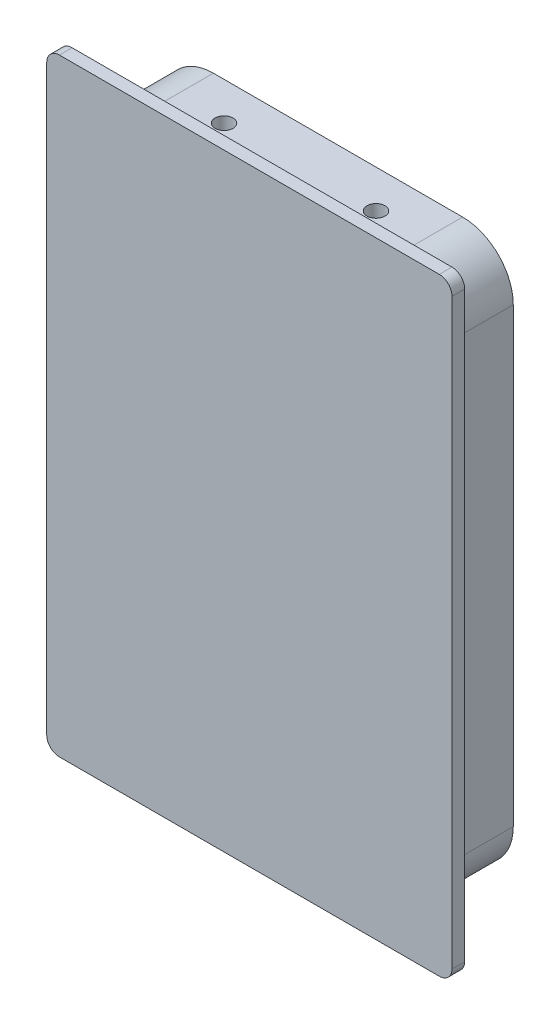
ISO-10303-21;
HEADER;
FILE_DESCRIPTION(('STEP AP214'),'2;1');
FILE_NAME('part.step','',(''),(''),'','','');
FILE_SCHEMA(('AUTOMOTIVE_DESIGN { 1 0 10303 214 1 1 1 1 }'));
ENDSEC;
DATA;
#1=APPLICATION_CONTEXT('core data for automotive mechanical design processes');
#2=APPLICATION_PROTOCOL_DEFINITION('international standard','automotive_design',2000,#1);
#3=PRODUCT_CONTEXT('',#1,'mechanical');
#4=PRODUCT('Part','Part','',(#3));
#5=PRODUCT_RELATED_PRODUCT_CATEGORY('part','',(#4));
#6=PRODUCT_DEFINITION_FORMATION('','',#4);
#7=PRODUCT_DEFINITION_CONTEXT('part definition',#1,'design');
#8=PRODUCT_DEFINITION('design','',#6,#7);
#9=PRODUCT_DEFINITION_SHAPE('','',#8);
#10=(LENGTH_UNIT() NAMED_UNIT(*) SI_UNIT(.MILLI.,.METRE.));
#11=(NAMED_UNIT(*) PLANE_ANGLE_UNIT() SI_UNIT($,.RADIAN.));
#12=(NAMED_UNIT(*) SI_UNIT($,.STERADIAN.) SOLID_ANGLE_UNIT());
#13=UNCERTAINTY_MEASURE_WITH_UNIT(LENGTH_MEASURE(1.E-05),#10,'distance_accuracy_value','');
#14=(GEOMETRIC_REPRESENTATION_CONTEXT(3) GLOBAL_UNCERTAINTY_ASSIGNED_CONTEXT((#13)) GLOBAL_UNIT_ASSIGNED_CONTEXT((#10,
#11,#12)) REPRESENTATION_CONTEXT('',''));
#15=CARTESIAN_POINT('',(0.,0.,0.));
#16=DIRECTION('',(0.,0.,1.));
#17=DIRECTION('',(1.,0.,0.));
#18=AXIS2_PLACEMENT_3D('',#15,#16,#17);
#19=CARTESIAN_POINT('',(25.4,38.1,0.));
#20=DIRECTION('',(0.,0.,-1.));
#21=DIRECTION('',(-1.,0.,0.));
#22=AXIS2_PLACEMENT_3D('',#19,#20,#21);
#23=PLANE('',#22);
#24=DIRECTION('',(1.,0.,0.));
#25=VECTOR('',#24,1.);
#26=CARTESIAN_POINT('',(-25.4,-38.1,0.));
#27=LINE('',#26,#25);
#28=CARTESIAN_POINT('',(-23.8125,-38.1,0.));
#29=VERTEX_POINT('',#28);
#30=CARTESIAN_POINT('',(23.8125,-38.1,0.));
#31=VERTEX_POINT('',#30);
#32=EDGE_CURVE('E285',#29,#31,#27,.T.);
#33=ORIENTED_EDGE('',*,*,#32,.F.);
#34=CARTESIAN_POINT('',(-23.8125,-36.5125,0.));
#35=DIRECTION('',(0.,0.,-1.));
#36=DIRECTION('',(-1.,0.,0.));
#37=AXIS2_PLACEMENT_3D('',#34,#35,#36);
#38=CIRCLE('',#37,1.5875);
#39=CARTESIAN_POINT('',(-25.4,-36.5125,0.));
#40=VERTEX_POINT('',#39);
#41=EDGE_CURVE('E349',#29,#40,#38,.T.);
#42=ORIENTED_EDGE('',*,*,#41,.T.);
#43=DIRECTION('',(0.,-1.,0.));
#44=VECTOR('',#43,1.);
#45=CARTESIAN_POINT('',(-25.4,-38.1,0.));
#46=LINE('',#45,#44);
#47=CARTESIAN_POINT('',(-25.4,36.5125,0.));
#48=VERTEX_POINT('',#47);
#49=EDGE_CURVE('E298',#48,#40,#46,.T.);
#50=ORIENTED_EDGE('',*,*,#49,.F.);
#51=CARTESIAN_POINT('',(-23.8125,36.5125,0.));
#52=DIRECTION('',(0.,0.,-1.));
#53=DIRECTION('',(-1.,0.,0.));
#54=AXIS2_PLACEMENT_3D('',#51,#52,#53);
#55=CIRCLE('',#54,1.5875);
#56=CARTESIAN_POINT('',(-23.8125,38.1,0.));
#57=VERTEX_POINT('',#56);
#58=EDGE_CURVE('E343',#48,#57,#55,.T.);
#59=ORIENTED_EDGE('',*,*,#58,.T.);
#60=DIRECTION('',(-1.,0.,0.));
#61=VECTOR('',#60,1.);
#62=CARTESIAN_POINT('',(-25.4,38.1,0.));
#63=LINE('',#62,#61);
#64=CARTESIAN_POINT('',(23.8125,38.1,0.));
#65=VERTEX_POINT('',#64);
#66=EDGE_CURVE('E296',#65,#57,#63,.T.);
#67=ORIENTED_EDGE('',*,*,#66,.F.);
#68=CARTESIAN_POINT('',(23.8125,36.5125,0.));
#69=DIRECTION('',(0.,0.,-1.));
#70=DIRECTION('',(-1.,0.,0.));
#71=AXIS2_PLACEMENT_3D('',#68,#69,#70);
#72=CIRCLE('',#71,1.5875);
#73=CARTESIAN_POINT('',(25.4,36.5125,0.));
#74=VERTEX_POINT('',#73);
#75=EDGE_CURVE('E345',#65,#74,#72,.T.);
#76=ORIENTED_EDGE('',*,*,#75,.T.);
#77=DIRECTION('',(0.,1.,0.));
#78=VECTOR('',#77,1.);
#79=CARTESIAN_POINT('',(25.4,-38.1,0.));
#80=LINE('',#79,#78);
#81=CARTESIAN_POINT('',(25.4,-36.5125,0.));
#82=VERTEX_POINT('',#81);
#83=EDGE_CURVE('E271',#82,#74,#80,.T.);
#84=ORIENTED_EDGE('',*,*,#83,.F.);
#85=CARTESIAN_POINT('',(23.8125,-36.5125,0.));
#86=DIRECTION('',(0.,0.,-1.));
#87=DIRECTION('',(-1.,0.,0.));
#88=AXIS2_PLACEMENT_3D('',#85,#86,#87);
#89=CIRCLE('',#88,1.5875);
#90=EDGE_CURVE('E347',#82,#31,#89,.T.);
#91=ORIENTED_EDGE('',*,*,#90,.T.);
#92=EDGE_LOOP('',(#33,#42,#50,#59,#67,#76,#84,#91));
#93=FACE_BOUND('',#92,.T.);
#94=DIRECTION('',(1.,0.,0.));
#95=VECTOR('',#94,1.);
#96=CARTESIAN_POINT('',(21.971,34.671,0.));
#97=LINE('',#96,#95);
#98=CARTESIAN_POINT('',(-15.621,34.671,0.));
#99=VERTEX_POINT('',#98);
#100=CARTESIAN_POINT('',(15.621,34.671,0.));
#101=VERTEX_POINT('',#100);
#102=EDGE_CURVE('E274',#99,#101,#97,.T.);
#103=ORIENTED_EDGE('',*,*,#102,.F.);
#104=CARTESIAN_POINT('',(-15.621,28.321,0.));
#105=DIRECTION('',(0.,0.,-1.));
#106=DIRECTION('',(-1.,0.,0.));
#107=AXIS2_PLACEMENT_3D('',#104,#105,#106);
#108=CIRCLE('',#107,6.35);
#109=CARTESIAN_POINT('',(-21.971,28.321,0.));
#110=VERTEX_POINT('',#109);
#111=EDGE_CURVE('E334',#99,#110,#108,.F.);
#112=ORIENTED_EDGE('',*,*,#111,.T.);
#113=DIRECTION('',(0.,1.,0.));
#114=VECTOR('',#113,1.);
#115=CARTESIAN_POINT('',(-21.971,-34.671,0.));
#116=LINE('',#115,#114);
#117=CARTESIAN_POINT('',(-21.971,-28.321,0.));
#118=VERTEX_POINT('',#117);
#119=EDGE_CURVE('E256',#118,#110,#116,.T.);
#120=ORIENTED_EDGE('',*,*,#119,.F.);
#121=CARTESIAN_POINT('',(-15.621,-28.321,0.));
#122=DIRECTION('',(0.,0.,-1.));
#123=DIRECTION('',(-1.,0.,0.));
#124=AXIS2_PLACEMENT_3D('',#121,#122,#123);
#125=CIRCLE('',#124,6.35);
#126=CARTESIAN_POINT('',(-15.621,-34.671,0.));
#127=VERTEX_POINT('',#126);
#128=EDGE_CURVE('E332',#118,#127,#125,.F.);
#129=ORIENTED_EDGE('',*,*,#128,.T.);
#130=DIRECTION('',(-1.,0.,0.));
#131=VECTOR('',#130,1.);
#132=CARTESIAN_POINT('',(21.971,-34.671,0.));
#133=LINE('',#132,#131);
#134=CARTESIAN_POINT('',(15.621,-34.671,0.));
#135=VERTEX_POINT('',#134);
#136=EDGE_CURVE('E262',#135,#127,#133,.T.);
#137=ORIENTED_EDGE('',*,*,#136,.F.);
#138=CARTESIAN_POINT('',(15.621,-28.321,0.));
#139=DIRECTION('',(0.,0.,-1.));
#140=DIRECTION('',(-1.,0.,0.));
#141=AXIS2_PLACEMENT_3D('',#138,#139,#140);
#142=CIRCLE('',#141,6.35);
#143=CARTESIAN_POINT('',(21.971,-28.321,0.));
#144=VERTEX_POINT('',#143);
#145=EDGE_CURVE('E330',#135,#144,#142,.F.);
#146=ORIENTED_EDGE('',*,*,#145,.T.);
#147=DIRECTION('',(0.,-1.,0.));
#148=VECTOR('',#147,1.);
#149=CARTESIAN_POINT('',(21.971,-34.671,0.));
#150=LINE('',#149,#148);
#151=CARTESIAN_POINT('',(21.971,28.321,0.));
#152=VERTEX_POINT('',#151);
#153=EDGE_CURVE('E277',#152,#144,#150,.T.);
#154=ORIENTED_EDGE('',*,*,#153,.F.);
#155=CARTESIAN_POINT('',(15.621,28.321,0.));
#156=DIRECTION('',(0.,0.,-1.));
#157=DIRECTION('',(-1.,0.,0.));
#158=AXIS2_PLACEMENT_3D('',#155,#156,#157);
#159=CIRCLE('',#158,6.35);
#160=EDGE_CURVE('E336',#152,#101,#159,.F.);
#161=ORIENTED_EDGE('',*,*,#160,.T.);
#162=EDGE_LOOP('',(#103,#112,#120,#129,#137,#146,#154,#161));
#163=FACE_BOUND('',#162,.T.);
#164=ADVANCED_FACE('F36',(#93,#163),#23,.T.);
#165=CARTESIAN_POINT('',(25.4,-38.1,1.5875));
#166=DIRECTION('',(-1.,0.,0.));
#167=DIRECTION('',(0.,0.,1.));
#168=AXIS2_PLACEMENT_3D('',#165,#166,#167);
#169=PLANE('',#168);
#170=DIRECTION('',(0.,1.,0.));
#171=VECTOR('',#170,1.);
#172=CARTESIAN_POINT('',(25.4,-38.1,1.5875));
#173=LINE('',#172,#171);
#174=CARTESIAN_POINT('',(25.4,-36.5125,1.5875));
#175=VERTEX_POINT('',#174);
#176=CARTESIAN_POINT('',(25.4,36.5125,1.5875));
#177=VERTEX_POINT('',#176);
#178=EDGE_CURVE('E282',#175,#177,#173,.T.);
#179=ORIENTED_EDGE('',*,*,#178,.F.);
#180=DIRECTION('',(0.,0.,-1.));
#181=VECTOR('',#180,1.);
#182=CARTESIAN_POINT('',(25.4,-36.5125,1.5875));
#183=LINE('',#182,#181);
#184=EDGE_CURVE('E365',#175,#82,#183,.T.);
#185=ORIENTED_EDGE('',*,*,#184,.T.);
#186=ORIENTED_EDGE('',*,*,#83,.T.);
#187=DIRECTION('',(0.,0.,-1.));
#188=VECTOR('',#187,1.);
#189=CARTESIAN_POINT('',(25.4,36.5125,1.5875));
#190=LINE('',#189,#188);
#191=EDGE_CURVE('E363',#74,#177,#190,.F.);
#192=ORIENTED_EDGE('',*,*,#191,.T.);
#193=EDGE_LOOP('',(#179,#185,#186,#192));
#194=FACE_BOUND('',#193,.T.);
#195=ADVANCED_FACE('F371',(#194),#169,.F.);
#196=CARTESIAN_POINT('',(-25.4,38.1,1.5875));
#197=DIRECTION('',(0.,-1.,0.));
#198=DIRECTION('',(0.,0.,-1.));
#199=AXIS2_PLACEMENT_3D('',#196,#197,#198);
#200=PLANE('',#199);
#201=DIRECTION('',(-1.,0.,0.));
#202=VECTOR('',#201,1.);
#203=CARTESIAN_POINT('',(-25.4,38.1,1.5875));
#204=LINE('',#203,#202);
#205=CARTESIAN_POINT('',(23.8125,38.1,1.5875));
#206=VERTEX_POINT('',#205);
#207=CARTESIAN_POINT('',(-23.8125,38.1,1.5875));
#208=VERTEX_POINT('',#207);
#209=EDGE_CURVE('E284',#206,#208,#204,.T.);
#210=ORIENTED_EDGE('',*,*,#209,.F.);
#211=DIRECTION('',(0.,0.,-1.));
#212=VECTOR('',#211,1.);
#213=CARTESIAN_POINT('',(23.8125,38.1,1.5875));
#214=LINE('',#213,#212);
#215=EDGE_CURVE('E11',#206,#65,#214,.T.);
#216=ORIENTED_EDGE('',*,*,#215,.T.);
#217=ORIENTED_EDGE('',*,*,#66,.T.);
#218=DIRECTION('',(0.,0.,-1.));
#219=VECTOR('',#218,1.);
#220=CARTESIAN_POINT('',(-23.8125,38.1,1.5875));
#221=LINE('',#220,#219);
#222=EDGE_CURVE('E44',#57,#208,#221,.F.);
#223=ORIENTED_EDGE('',*,*,#222,.T.);
#224=EDGE_LOOP('',(#210,#216,#217,#223));
#225=FACE_BOUND('',#224,.T.);
#226=ADVANCED_FACE('F382',(#225),#200,.F.);
#227=CARTESIAN_POINT('',(-25.4,-38.1,1.5875));
#228=DIRECTION('',(1.,0.,0.));
#229=DIRECTION('',(0.,0.,-1.));
#230=AXIS2_PLACEMENT_3D('',#227,#228,#229);
#231=PLANE('',#230);
#232=ORIENTED_EDGE('',*,*,#49,.T.);
#233=DIRECTION('',(0.,0.,-1.));
#234=VECTOR('',#233,1.);
#235=CARTESIAN_POINT('',(-25.4,-36.5125,1.5875));
#236=LINE('',#235,#234);
#237=CARTESIAN_POINT('',(-25.4,-36.5125,1.5875));
#238=VERTEX_POINT('',#237);
#239=EDGE_CURVE('E354',#40,#238,#236,.F.);
#240=ORIENTED_EDGE('',*,*,#239,.T.);
#241=DIRECTION('',(0.,-1.,0.));
#242=VECTOR('',#241,1.);
#243=CARTESIAN_POINT('',(-25.4,-38.1,1.5875));
#244=LINE('',#243,#242);
#245=CARTESIAN_POINT('',(-25.4,36.5125,1.5875));
#246=VERTEX_POINT('',#245);
#247=EDGE_CURVE('E287',#246,#238,#244,.T.);
#248=ORIENTED_EDGE('',*,*,#247,.F.);
#249=DIRECTION('',(0.,0.,-1.));
#250=VECTOR('',#249,1.);
#251=CARTESIAN_POINT('',(-25.4,36.5125,1.5875));
#252=LINE('',#251,#250);
#253=EDGE_CURVE('E351',#246,#48,#252,.T.);
#254=ORIENTED_EDGE('',*,*,#253,.T.);
#255=EDGE_LOOP('',(#232,#240,#248,#254));
#256=FACE_BOUND('',#255,.T.);
#257=ADVANCED_FACE('F390',(#256),#231,.F.);
#258=CARTESIAN_POINT('',(-25.4,-38.1,1.5875));
#259=DIRECTION('',(0.,1.,0.));
#260=DIRECTION('',(0.,0.,1.));
#261=AXIS2_PLACEMENT_3D('',#258,#259,#260);
#262=PLANE('',#261);
#263=DIRECTION('',(1.,0.,0.));
#264=VECTOR('',#263,1.);
#265=CARTESIAN_POINT('',(-25.4,-38.1,1.5875));
#266=LINE('',#265,#264);
#267=CARTESIAN_POINT('',(-23.8125,-38.1,1.5875));
#268=VERTEX_POINT('',#267);
#269=CARTESIAN_POINT('',(23.8125,-38.1,1.5875));
#270=VERTEX_POINT('',#269);
#271=EDGE_CURVE('E290',#268,#270,#266,.T.);
#272=ORIENTED_EDGE('',*,*,#271,.F.);
#273=DIRECTION('',(0.,0.,-1.));
#274=VECTOR('',#273,1.);
#275=CARTESIAN_POINT('',(-23.8125,-38.1,1.5875));
#276=LINE('',#275,#274);
#277=EDGE_CURVE('E340',#268,#29,#276,.T.);
#278=ORIENTED_EDGE('',*,*,#277,.T.);
#279=ORIENTED_EDGE('',*,*,#32,.T.);
#280=DIRECTION('',(0.,0.,-1.));
#281=VECTOR('',#280,1.);
#282=CARTESIAN_POINT('',(23.8125,-38.1,1.5875));
#283=LINE('',#282,#281);
#284=EDGE_CURVE('E338',#31,#270,#283,.F.);
#285=ORIENTED_EDGE('',*,*,#284,.T.);
#286=EDGE_LOOP('',(#272,#278,#279,#285));
#287=FACE_BOUND('',#286,.T.);
#288=ADVANCED_FACE('F398',(#287),#262,.F.);
#289=CARTESIAN_POINT('',(25.4,38.1,1.5875));
#290=DIRECTION('',(0.,0.,-1.));
#291=DIRECTION('',(-1.,0.,0.));
#292=AXIS2_PLACEMENT_3D('',#289,#290,#291);
#293=PLANE('',#292);
#294=ORIENTED_EDGE('',*,*,#247,.T.);
#295=CARTESIAN_POINT('',(-23.8125,-36.5125,1.5875));
#296=DIRECTION('',(0.,0.,-1.));
#297=DIRECTION('',(-1.,0.,0.));
#298=AXIS2_PLACEMENT_3D('',#295,#296,#297);
#299=CIRCLE('',#298,1.5875);
#300=EDGE_CURVE('E361',#238,#268,#299,.F.);
#301=ORIENTED_EDGE('',*,*,#300,.T.);
#302=ORIENTED_EDGE('',*,*,#271,.T.);
#303=CARTESIAN_POINT('',(23.8125,-36.5125,1.5875));
#304=DIRECTION('',(0.,0.,-1.));
#305=DIRECTION('',(-1.,0.,0.));
#306=AXIS2_PLACEMENT_3D('',#303,#304,#305);
#307=CIRCLE('',#306,1.5875);
#308=EDGE_CURVE('E359',#270,#175,#307,.F.);
#309=ORIENTED_EDGE('',*,*,#308,.T.);
#310=ORIENTED_EDGE('',*,*,#178,.T.);
#311=CARTESIAN_POINT('',(23.8125,36.5125,1.5875));
#312=DIRECTION('',(0.,0.,-1.));
#313=DIRECTION('',(-1.,0.,0.));
#314=AXIS2_PLACEMENT_3D('',#311,#312,#313);
#315=CIRCLE('',#314,1.5875);
#316=EDGE_CURVE('E57',#177,#206,#315,.F.);
#317=ORIENTED_EDGE('',*,*,#316,.T.);
#318=ORIENTED_EDGE('',*,*,#209,.T.);
#319=CARTESIAN_POINT('',(-23.8125,36.5125,1.5875));
#320=DIRECTION('',(0.,0.,-1.));
#321=DIRECTION('',(-1.,0.,0.));
#322=AXIS2_PLACEMENT_3D('',#319,#320,#321);
#323=CIRCLE('',#322,1.5875);
#324=EDGE_CURVE('E356',#208,#246,#323,.F.);
#325=ORIENTED_EDGE('',*,*,#324,.T.);
#326=EDGE_LOOP('',(#294,#301,#302,#309,#310,#317,#318,#325));
#327=FACE_BOUND('',#326,.T.);
#328=ADVANCED_FACE('F384',(#327),#293,.F.);
#329=CARTESIAN_POINT('',(-21.971,-34.671,-9.525));
#330=DIRECTION('',(1.,0.,0.));
#331=DIRECTION('',(0.,0.,-1.));
#332=AXIS2_PLACEMENT_3D('',#329,#330,#331);
#333=PLANE('',#332);
#334=DIRECTION('',(0.,1.,0.));
#335=VECTOR('',#334,1.);
#336=CARTESIAN_POINT('',(-21.971,-34.671,-9.525));
#337=LINE('',#336,#335);
#338=CARTESIAN_POINT('',(-21.971,-28.321,-9.525));
#339=VERTEX_POINT('',#338);
#340=CARTESIAN_POINT('',(-21.971,28.321,-9.525));
#341=VERTEX_POINT('',#340);
#342=EDGE_CURVE('E258',#339,#341,#337,.T.);
#343=ORIENTED_EDGE('',*,*,#342,.F.);
#344=DIRECTION('',(0.,0.,1.));
#345=VECTOR('',#344,1.);
#346=CARTESIAN_POINT('',(-21.971,-28.321,-9.525));
#347=LINE('',#346,#345);
#348=EDGE_CURVE('E322',#339,#118,#347,.T.);
#349=ORIENTED_EDGE('',*,*,#348,.T.);
#350=ORIENTED_EDGE('',*,*,#119,.T.);
#351=DIRECTION('',(0.,0.,1.));
#352=VECTOR('',#351,1.);
#353=CARTESIAN_POINT('',(-21.971,28.321,-9.525));
#354=LINE('',#353,#352);
#355=EDGE_CURVE('E320',#110,#341,#354,.F.);
#356=ORIENTED_EDGE('',*,*,#355,.T.);
#357=EDGE_LOOP('',(#343,#349,#350,#356));
#358=FACE_BOUND('',#357,.T.);
#359=ADVANCED_FACE('F467',(#358),#333,.F.);
#360=CARTESIAN_POINT('',(21.971,34.671,-9.525));
#361=DIRECTION('',(0.,-1.,0.));
#362=DIRECTION('',(0.,0.,-1.));
#363=AXIS2_PLACEMENT_3D('',#360,#361,#362);
#364=PLANE('',#363);
#365=CARTESIAN_POINT('',(9.525,34.671,-4.7625));
#366=DIRECTION('',(0.,1.,0.));
#367=DIRECTION('',(0.,0.,1.));
#368=AXIS2_PLACEMENT_3D('',#365,#366,#367);
#369=CIRCLE('',#368,1.13029999999999);
#370=CARTESIAN_POINT('',(9.525,34.671,-3.63220000000001));
#371=VERTEX_POINT('',#370);
#372=EDGE_CURVE('E549',#371,#371,#369,.T.);
#373=ORIENTED_EDGE('',*,*,#372,.F.);
#374=EDGE_LOOP('',(#373));
#375=FACE_BOUND('',#374,.T.);
#376=CARTESIAN_POINT('',(-9.525,34.671,-4.7625));
#377=DIRECTION('',(0.,1.,0.));
#378=DIRECTION('',(0.,0.,1.));
#379=AXIS2_PLACEMENT_3D('',#376,#377,#378);
#380=CIRCLE('',#379,1.13029999999999);
#381=CARTESIAN_POINT('',(-9.525,34.671,-3.63220000000001));
#382=VERTEX_POINT('',#381);
#383=EDGE_CURVE('E555',#382,#382,#380,.T.);
#384=ORIENTED_EDGE('',*,*,#383,.F.);
#385=EDGE_LOOP('',(#384));
#386=FACE_BOUND('',#385,.T.);
#387=DIRECTION('',(1.,0.,0.));
#388=VECTOR('',#387,1.);
#389=CARTESIAN_POINT('',(21.971,34.671,-9.525));
#390=LINE('',#389,#388);
#391=CARTESIAN_POINT('',(-15.621,34.671,-9.525));
#392=VERTEX_POINT('',#391);
#393=CARTESIAN_POINT('',(15.621,34.671,-9.525));
#394=VERTEX_POINT('',#393);
#395=EDGE_CURVE('E261',#392,#394,#390,.T.);
#396=ORIENTED_EDGE('',*,*,#395,.F.);
#397=DIRECTION('',(0.,0.,1.));
#398=VECTOR('',#397,1.);
#399=CARTESIAN_POINT('',(-15.621,34.671,-9.525));
#400=LINE('',#399,#398);
#401=EDGE_CURVE('E327',#392,#99,#400,.T.);
#402=ORIENTED_EDGE('',*,*,#401,.T.);
#403=ORIENTED_EDGE('',*,*,#102,.T.);
#404=DIRECTION('',(0.,0.,1.));
#405=VECTOR('',#404,1.);
#406=CARTESIAN_POINT('',(15.621,34.671,-9.525));
#407=LINE('',#406,#405);
#408=EDGE_CURVE('E325',#101,#394,#407,.F.);
#409=ORIENTED_EDGE('',*,*,#408,.T.);
#410=EDGE_LOOP('',(#396,#402,#403,#409));
#411=FACE_BOUND('',#410,.T.);
#412=ADVANCED_FACE('F472',(#375,#386,#411),#364,.F.);
#413=CARTESIAN_POINT('',(21.971,-34.671,-9.525));
#414=DIRECTION('',(-1.,0.,0.));
#415=DIRECTION('',(0.,0.,1.));
#416=AXIS2_PLACEMENT_3D('',#413,#414,#415);
#417=PLANE('',#416);
#418=ORIENTED_EDGE('',*,*,#153,.T.);
#419=DIRECTION('',(0.,0.,1.));
#420=VECTOR('',#419,1.);
#421=CARTESIAN_POINT('',(21.971,-28.321,-9.525));
#422=LINE('',#421,#420);
#423=CARTESIAN_POINT('',(21.971,-28.321,-9.525));
#424=VERTEX_POINT('',#423);
#425=EDGE_CURVE('E310',#144,#424,#422,.F.);
#426=ORIENTED_EDGE('',*,*,#425,.T.);
#427=DIRECTION('',(0.,-1.,0.));
#428=VECTOR('',#427,1.);
#429=CARTESIAN_POINT('',(21.971,-34.671,-9.525));
#430=LINE('',#429,#428);
#431=CARTESIAN_POINT('',(21.971,28.321,-9.525));
#432=VERTEX_POINT('',#431);
#433=EDGE_CURVE('E265',#432,#424,#430,.T.);
#434=ORIENTED_EDGE('',*,*,#433,.F.);
#435=DIRECTION('',(0.,0.,1.));
#436=VECTOR('',#435,1.);
#437=CARTESIAN_POINT('',(21.971,28.321,-9.525));
#438=LINE('',#437,#436);
#439=EDGE_CURVE('E307',#432,#152,#438,.T.);
#440=ORIENTED_EDGE('',*,*,#439,.T.);
#441=EDGE_LOOP('',(#418,#426,#434,#440));
#442=FACE_BOUND('',#441,.T.);
#443=ADVANCED_FACE('F453',(#442),#417,.F.);
#444=CARTESIAN_POINT('',(21.971,-34.671,-9.525));
#445=DIRECTION('',(0.,1.,0.));
#446=DIRECTION('',(0.,0.,1.));
#447=AXIS2_PLACEMENT_3D('',#444,#445,#446);
#448=PLANE('',#447);
#449=CARTESIAN_POINT('',(9.525,-34.671,-4.7625));
#450=DIRECTION('',(0.,-1.,0.));
#451=DIRECTION('',(0.,0.,-1.));
#452=AXIS2_PLACEMENT_3D('',#449,#450,#451);
#453=CIRCLE('',#452,1.13029999999999);
#454=CARTESIAN_POINT('',(9.525,-34.671,-5.89279999999999));
#455=VERTEX_POINT('',#454);
#456=EDGE_CURVE('E539',#455,#455,#453,.T.);
#457=ORIENTED_EDGE('',*,*,#456,.F.);
#458=EDGE_LOOP('',(#457));
#459=FACE_BOUND('',#458,.T.);
#460=CARTESIAN_POINT('',(-9.525,-34.671,-4.7625));
#461=DIRECTION('',(0.,-1.,0.));
#462=DIRECTION('',(0.,0.,-1.));
#463=AXIS2_PLACEMENT_3D('',#460,#461,#462);
#464=CIRCLE('',#463,1.13029999999999);
#465=CARTESIAN_POINT('',(-9.525,-34.671,-5.89279999999999));
#466=VERTEX_POINT('',#465);
#467=EDGE_CURVE('E541',#466,#466,#464,.T.);
#468=ORIENTED_EDGE('',*,*,#467,.F.);
#469=EDGE_LOOP('',(#468));
#470=FACE_BOUND('',#469,.T.);
#471=DIRECTION('',(-1.,0.,0.));
#472=VECTOR('',#471,1.);
#473=CARTESIAN_POINT('',(21.971,-34.671,-9.525));
#474=LINE('',#473,#472);
#475=CARTESIAN_POINT('',(15.621,-34.671,-9.525));
#476=VERTEX_POINT('',#475);
#477=CARTESIAN_POINT('',(-15.621,-34.671,-9.525));
#478=VERTEX_POINT('',#477);
#479=EDGE_CURVE('E268',#476,#478,#474,.T.);
#480=ORIENTED_EDGE('',*,*,#479,.F.);
#481=DIRECTION('',(0.,0.,1.));
#482=VECTOR('',#481,1.);
#483=CARTESIAN_POINT('',(15.621,-34.671,-9.525));
#484=LINE('',#483,#482);
#485=EDGE_CURVE('E304',#476,#135,#484,.T.);
#486=ORIENTED_EDGE('',*,*,#485,.T.);
#487=ORIENTED_EDGE('',*,*,#136,.T.);
#488=DIRECTION('',(0.,0.,1.));
#489=VECTOR('',#488,1.);
#490=CARTESIAN_POINT('',(-15.621,-34.671,-9.525));
#491=LINE('',#490,#489);
#492=EDGE_CURVE('E293',#127,#478,#491,.F.);
#493=ORIENTED_EDGE('',*,*,#492,.T.);
#494=EDGE_LOOP('',(#480,#486,#487,#493));
#495=FACE_BOUND('',#494,.T.);
#496=ADVANCED_FACE('F460',(#459,#470,#495),#448,.F.);
#497=CARTESIAN_POINT('',(-21.971,34.671,-9.525));
#498=DIRECTION('',(0.,0.,1.));
#499=DIRECTION('',(1.,0.,0.));
#500=AXIS2_PLACEMENT_3D('',#497,#498,#499);
#501=PLANE('',#500);
#502=DIRECTION('',(0.,-1.,0.));
#503=VECTOR('',#502,1.);
#504=CARTESIAN_POINT('',(18.796,28.321,-9.525));
#505=LINE('',#504,#503);
#506=CARTESIAN_POINT('',(18.796,28.321,-9.525));
#507=VERTEX_POINT('',#506);
#508=CARTESIAN_POINT('',(18.796,-28.321,-9.525));
#509=VERTEX_POINT('',#508);
#510=EDGE_CURVE('E214',#507,#509,#505,.T.);
#511=ORIENTED_EDGE('',*,*,#510,.F.);
#512=CARTESIAN_POINT('',(15.621,28.321,-9.525));
#513=DIRECTION('',(0.,0.,-1.));
#514=DIRECTION('',(-1.,0.,0.));
#515=AXIS2_PLACEMENT_3D('',#512,#513,#514);
#516=CIRCLE('',#515,3.175);
#517=CARTESIAN_POINT('',(15.621,31.496,-9.525));
#518=VERTEX_POINT('',#517);
#519=EDGE_CURVE('E219',#518,#507,#516,.T.);
#520=ORIENTED_EDGE('',*,*,#519,.F.);
#521=DIRECTION('',(1.,0.,0.));
#522=VECTOR('',#521,1.);
#523=CARTESIAN_POINT('',(-15.621,31.496,-9.525));
#524=LINE('',#523,#522);
#525=CARTESIAN_POINT('',(-15.621,31.496,-9.525));
#526=VERTEX_POINT('',#525);
#527=EDGE_CURVE('E239',#526,#518,#524,.T.);
#528=ORIENTED_EDGE('',*,*,#527,.F.);
#529=CARTESIAN_POINT('',(-15.621,28.321,-9.525));
#530=DIRECTION('',(0.,0.,-1.));
#531=DIRECTION('',(-1.,0.,0.));
#532=AXIS2_PLACEMENT_3D('',#529,#530,#531);
#533=CIRCLE('',#532,3.175);
#534=CARTESIAN_POINT('',(-18.796,28.321,-9.525));
#535=VERTEX_POINT('',#534);
#536=EDGE_CURVE('E236',#535,#526,#533,.T.);
#537=ORIENTED_EDGE('',*,*,#536,.F.);
#538=DIRECTION('',(0.,1.,0.));
#539=VECTOR('',#538,1.);
#540=CARTESIAN_POINT('',(-18.796,-28.321,-9.525));
#541=LINE('',#540,#539);
#542=CARTESIAN_POINT('',(-18.796,-28.321,-9.525));
#543=VERTEX_POINT('',#542);
#544=EDGE_CURVE('E233',#543,#535,#541,.T.);
#545=ORIENTED_EDGE('',*,*,#544,.F.);
#546=CARTESIAN_POINT('',(-15.621,-28.321,-9.525));
#547=DIRECTION('',(0.,0.,-1.));
#548=DIRECTION('',(-1.,0.,0.));
#549=AXIS2_PLACEMENT_3D('',#546,#547,#548);
#550=CIRCLE('',#549,3.175);
#551=CARTESIAN_POINT('',(-15.621,-31.496,-9.525));
#552=VERTEX_POINT('',#551);
#553=EDGE_CURVE('E227',#552,#543,#550,.T.);
#554=ORIENTED_EDGE('',*,*,#553,.F.);
#555=DIRECTION('',(-1.,0.,0.));
#556=VECTOR('',#555,1.);
#557=CARTESIAN_POINT('',(15.621,-31.496,-9.525));
#558=LINE('',#557,#556);
#559=CARTESIAN_POINT('',(15.621,-31.496,-9.525));
#560=VERTEX_POINT('',#559);
#561=EDGE_CURVE('E225',#560,#552,#558,.T.);
#562=ORIENTED_EDGE('',*,*,#561,.F.);
#563=CARTESIAN_POINT('',(15.621,-28.321,-9.525));
#564=DIRECTION('',(0.,0.,-1.));
#565=DIRECTION('',(-1.,0.,0.));
#566=AXIS2_PLACEMENT_3D('',#563,#564,#565);
#567=CIRCLE('',#566,3.175);
#568=EDGE_CURVE('E203',#509,#560,#567,.T.);
#569=ORIENTED_EDGE('',*,*,#568,.F.);
#570=EDGE_LOOP('',(#511,#520,#528,#537,#545,#554,#562,#569));
#571=FACE_BOUND('',#570,.T.);
#572=ORIENTED_EDGE('',*,*,#433,.T.);
#573=CARTESIAN_POINT('',(15.621,-28.321,-9.525));
#574=DIRECTION('',(0.,0.,1.));
#575=DIRECTION('',(1.,0.,0.));
#576=AXIS2_PLACEMENT_3D('',#573,#574,#575);
#577=CIRCLE('',#576,6.35);
#578=EDGE_CURVE('E318',#424,#476,#577,.F.);
#579=ORIENTED_EDGE('',*,*,#578,.T.);
#580=ORIENTED_EDGE('',*,*,#479,.T.);
#581=CARTESIAN_POINT('',(-15.621,-28.321,-9.525));
#582=DIRECTION('',(0.,0.,1.));
#583=DIRECTION('',(1.,0.,0.));
#584=AXIS2_PLACEMENT_3D('',#581,#582,#583);
#585=CIRCLE('',#584,6.35);
#586=EDGE_CURVE('E316',#478,#339,#585,.F.);
#587=ORIENTED_EDGE('',*,*,#586,.T.);
#588=ORIENTED_EDGE('',*,*,#342,.T.);
#589=CARTESIAN_POINT('',(-15.621,28.321,-9.525));
#590=DIRECTION('',(0.,0.,1.));
#591=DIRECTION('',(1.,0.,0.));
#592=AXIS2_PLACEMENT_3D('',#589,#590,#591);
#593=CIRCLE('',#592,6.35);
#594=EDGE_CURVE('E314',#341,#392,#593,.F.);
#595=ORIENTED_EDGE('',*,*,#594,.T.);
#596=ORIENTED_EDGE('',*,*,#395,.T.);
#597=CARTESIAN_POINT('',(15.621,28.321,-9.525));
#598=DIRECTION('',(0.,0.,1.));
#599=DIRECTION('',(1.,0.,0.));
#600=AXIS2_PLACEMENT_3D('',#597,#598,#599);
#601=CIRCLE('',#600,6.35);
#602=EDGE_CURVE('E312',#394,#432,#601,.F.);
#603=ORIENTED_EDGE('',*,*,#602,.T.);
#604=EDGE_LOOP('',(#572,#579,#580,#587,#588,#595,#596,#603));
#605=FACE_BOUND('',#604,.T.);
#606=ADVANCED_FACE('F221',(#571,#605),#501,.F.);
#607=CARTESIAN_POINT('',(15.621,-28.321,-9.525));
#608=DIRECTION('',(0.,0.,1.));
#609=DIRECTION('',(1.,0.,0.));
#610=AXIS2_PLACEMENT_3D('',#607,#608,#609);
#611=CYLINDRICAL_SURFACE('',#610,6.35);
#612=ORIENTED_EDGE('',*,*,#578,.F.);
#613=ORIENTED_EDGE('',*,*,#425,.F.);
#614=ORIENTED_EDGE('',*,*,#145,.F.);
#615=ORIENTED_EDGE('',*,*,#485,.F.);
#616=EDGE_LOOP('',(#612,#613,#614,#615));
#617=FACE_BOUND('',#616,.T.);
#618=ADVANCED_FACE('F424',(#617),#611,.T.);
#619=CARTESIAN_POINT('',(-15.621,-28.321,-9.525));
#620=DIRECTION('',(0.,0.,1.));
#621=DIRECTION('',(1.,0.,0.));
#622=AXIS2_PLACEMENT_3D('',#619,#620,#621);
#623=CYLINDRICAL_SURFACE('',#622,6.35);
#624=ORIENTED_EDGE('',*,*,#586,.F.);
#625=ORIENTED_EDGE('',*,*,#492,.F.);
#626=ORIENTED_EDGE('',*,*,#128,.F.);
#627=ORIENTED_EDGE('',*,*,#348,.F.);
#628=EDGE_LOOP('',(#624,#625,#626,#627));
#629=FACE_BOUND('',#628,.T.);
#630=ADVANCED_FACE('F427',(#629),#623,.T.);
#631=CARTESIAN_POINT('',(-15.621,28.321,-9.525));
#632=DIRECTION('',(0.,0.,1.));
#633=DIRECTION('',(1.,0.,0.));
#634=AXIS2_PLACEMENT_3D('',#631,#632,#633);
#635=CYLINDRICAL_SURFACE('',#634,6.35);
#636=ORIENTED_EDGE('',*,*,#594,.F.);
#637=ORIENTED_EDGE('',*,*,#355,.F.);
#638=ORIENTED_EDGE('',*,*,#111,.F.);
#639=ORIENTED_EDGE('',*,*,#401,.F.);
#640=EDGE_LOOP('',(#636,#637,#638,#639));
#641=FACE_BOUND('',#640,.T.);
#642=ADVANCED_FACE('F431',(#641),#635,.T.);
#643=CARTESIAN_POINT('',(15.621,28.321,-9.525));
#644=DIRECTION('',(0.,0.,1.));
#645=DIRECTION('',(1.,0.,0.));
#646=AXIS2_PLACEMENT_3D('',#643,#644,#645);
#647=CYLINDRICAL_SURFACE('',#646,6.35);
#648=ORIENTED_EDGE('',*,*,#602,.F.);
#649=ORIENTED_EDGE('',*,*,#408,.F.);
#650=ORIENTED_EDGE('',*,*,#160,.F.);
#651=ORIENTED_EDGE('',*,*,#439,.F.);
#652=EDGE_LOOP('',(#648,#649,#650,#651));
#653=FACE_BOUND('',#652,.T.);
#654=ADVANCED_FACE('F435',(#653),#647,.T.);
#655=CARTESIAN_POINT('',(15.621,28.321,73.3563257531346));
#656=DIRECTION('',(0.,0.,-1.));
#657=DIRECTION('',(-1.,0.,0.));
#658=AXIS2_PLACEMENT_3D('',#655,#656,#657);
#659=CYLINDRICAL_SURFACE('',#658,3.175);
#660=CARTESIAN_POINT('',(15.621,28.321,0.));
#661=DIRECTION('',(0.,0.,-1.));
#662=DIRECTION('',(-1.,0.,0.));
#663=AXIS2_PLACEMENT_3D('',#660,#661,#662);
#664=CIRCLE('',#663,3.175);
#665=CARTESIAN_POINT('',(18.796,28.321,0.));
#666=VERTEX_POINT('',#665);
#667=CARTESIAN_POINT('',(15.621,31.496,0.));
#668=VERTEX_POINT('',#667);
#669=EDGE_CURVE('E257',#666,#668,#664,.F.);
#670=ORIENTED_EDGE('',*,*,#669,.T.);
#671=DIRECTION('',(0.,0.,-1.));
#672=VECTOR('',#671,1.);
#673=CARTESIAN_POINT('',(15.621,31.496,73.3563257531346));
#674=LINE('',#673,#672);
#675=EDGE_CURVE('E242',#668,#518,#674,.T.);
#676=ORIENTED_EDGE('',*,*,#675,.T.);
#677=ORIENTED_EDGE('',*,*,#519,.T.);
#678=DIRECTION('',(0.,0.,-1.));
#679=VECTOR('',#678,1.);
#680=CARTESIAN_POINT('',(18.796,28.321,73.3563257531346));
#681=LINE('',#680,#679);
#682=EDGE_CURVE('E210',#666,#507,#681,.T.);
#683=ORIENTED_EDGE('',*,*,#682,.F.);
#684=EDGE_LOOP('',(#670,#676,#677,#683));
#685=FACE_BOUND('',#684,.T.);
#686=ADVANCED_FACE('F438',(#685),#659,.F.);
#687=CARTESIAN_POINT('',(-15.621,31.496,73.3563257531346));
#688=DIRECTION('',(0.,1.,0.));
#689=DIRECTION('',(-1.,0.,0.));
#690=AXIS2_PLACEMENT_3D('',#687,#688,#689);
#691=PLANE('',#690);
#692=CARTESIAN_POINT('',(9.525,31.496,-4.7625));
#693=DIRECTION('',(0.,1.,0.));
#694=DIRECTION('',(-1.,0.,0.));
#695=AXIS2_PLACEMENT_3D('',#692,#693,#694);
#696=CIRCLE('',#695,1.13029999999999);
#697=CARTESIAN_POINT('',(8.39470000000001,31.496,-4.7625));
#698=VERTEX_POINT('',#697);
#699=EDGE_CURVE('E552',#698,#698,#696,.T.);
#700=ORIENTED_EDGE('',*,*,#699,.T.);
#701=EDGE_LOOP('',(#700));
#702=FACE_BOUND('',#701,.T.);
#703=CARTESIAN_POINT('',(-9.525,31.496,-4.7625));
#704=DIRECTION('',(0.,1.,0.));
#705=DIRECTION('',(-1.,0.,0.));
#706=AXIS2_PLACEMENT_3D('',#703,#704,#705);
#707=CIRCLE('',#706,1.13029999999999);
#708=CARTESIAN_POINT('',(-10.6553,31.496,-4.7625));
#709=VERTEX_POINT('',#708);
#710=EDGE_CURVE('E558',#709,#709,#707,.T.);
#711=ORIENTED_EDGE('',*,*,#710,.T.);
#712=EDGE_LOOP('',(#711));
#713=FACE_BOUND('',#712,.T.);
#714=DIRECTION('',(-1.,0.,0.));
#715=VECTOR('',#714,1.);
#716=CARTESIAN_POINT('',(-15.621,31.496,0.));
#717=LINE('',#716,#715);
#718=CARTESIAN_POINT('',(-15.621,31.496,0.));
#719=VERTEX_POINT('',#718);
#720=EDGE_CURVE('E570',#668,#719,#717,.T.);
#721=ORIENTED_EDGE('',*,*,#720,.T.);
#722=DIRECTION('',(0.,0.,-1.));
#723=VECTOR('',#722,1.);
#724=CARTESIAN_POINT('',(-15.621,31.496,73.3563257531346));
#725=LINE('',#724,#723);
#726=EDGE_CURVE('E244',#719,#526,#725,.T.);
#727=ORIENTED_EDGE('',*,*,#726,.T.);
#728=ORIENTED_EDGE('',*,*,#527,.T.);
#729=ORIENTED_EDGE('',*,*,#675,.F.);
#730=EDGE_LOOP('',(#721,#727,#728,#729));
#731=FACE_BOUND('',#730,.T.);
#732=ADVANCED_FACE('F443',(#702,#713,#731),#691,.F.);
#733=CARTESIAN_POINT('',(-15.621,28.321,73.3563257531346));
#734=DIRECTION('',(0.,0.,-1.));
#735=DIRECTION('',(-1.,0.,0.));
#736=AXIS2_PLACEMENT_3D('',#733,#734,#735);
#737=CYLINDRICAL_SURFACE('',#736,3.175);
#738=CARTESIAN_POINT('',(-15.621,28.321,0.));
#739=DIRECTION('',(0.,0.,-1.));
#740=DIRECTION('',(-1.,0.,0.));
#741=AXIS2_PLACEMENT_3D('',#738,#739,#740);
#742=CIRCLE('',#741,3.175);
#743=CARTESIAN_POINT('',(-18.796,28.321,0.));
#744=VERTEX_POINT('',#743);
#745=EDGE_CURVE('E568',#719,#744,#742,.F.);
#746=ORIENTED_EDGE('',*,*,#745,.T.);
#747=DIRECTION('',(0.,0.,-1.));
#748=VECTOR('',#747,1.);
#749=CARTESIAN_POINT('',(-18.796,28.321,73.3563257531346));
#750=LINE('',#749,#748);
#751=EDGE_CURVE('E246',#744,#535,#750,.T.);
#752=ORIENTED_EDGE('',*,*,#751,.T.);
#753=ORIENTED_EDGE('',*,*,#536,.T.);
#754=ORIENTED_EDGE('',*,*,#726,.F.);
#755=EDGE_LOOP('',(#746,#752,#753,#754));
#756=FACE_BOUND('',#755,.T.);
#757=ADVANCED_FACE('F506',(#756),#737,.F.);
#758=CARTESIAN_POINT('',(-18.796,-28.321,73.3563257531346));
#759=DIRECTION('',(-1.,0.,0.));
#760=DIRECTION('',(0.,-1.,0.));
#761=AXIS2_PLACEMENT_3D('',#758,#759,#760);
#762=PLANE('',#761);
#763=DIRECTION('',(0.,-1.,0.));
#764=VECTOR('',#763,1.);
#765=CARTESIAN_POINT('',(-18.796,-28.321,0.));
#766=LINE('',#765,#764);
#767=CARTESIAN_POINT('',(-18.796,-28.321,0.));
#768=VERTEX_POINT('',#767);
#769=EDGE_CURVE('E566',#744,#768,#766,.T.);
#770=ORIENTED_EDGE('',*,*,#769,.T.);
#771=DIRECTION('',(0.,0.,-1.));
#772=VECTOR('',#771,1.);
#773=CARTESIAN_POINT('',(-18.796,-28.321,73.3563257531346));
#774=LINE('',#773,#772);
#775=EDGE_CURVE('E248',#768,#543,#774,.T.);
#776=ORIENTED_EDGE('',*,*,#775,.T.);
#777=ORIENTED_EDGE('',*,*,#544,.T.);
#778=ORIENTED_EDGE('',*,*,#751,.F.);
#779=EDGE_LOOP('',(#770,#776,#777,#778));
#780=FACE_BOUND('',#779,.T.);
#781=ADVANCED_FACE('F502',(#780),#762,.F.);
#782=CARTESIAN_POINT('',(-15.621,-28.321,73.3563257531346));
#783=DIRECTION('',(0.,0.,-1.));
#784=DIRECTION('',(-1.,0.,0.));
#785=AXIS2_PLACEMENT_3D('',#782,#783,#784);
#786=CYLINDRICAL_SURFACE('',#785,3.175);
#787=CARTESIAN_POINT('',(-15.621,-28.321,0.));
#788=DIRECTION('',(0.,0.,-1.));
#789=DIRECTION('',(-1.,0.,0.));
#790=AXIS2_PLACEMENT_3D('',#787,#788,#789);
#791=CIRCLE('',#790,3.175);
#792=CARTESIAN_POINT('',(-15.621,-31.496,0.));
#793=VERTEX_POINT('',#792);
#794=EDGE_CURVE('E564',#768,#793,#791,.F.);
#795=ORIENTED_EDGE('',*,*,#794,.T.);
#796=DIRECTION('',(0.,0.,-1.));
#797=VECTOR('',#796,1.);
#798=CARTESIAN_POINT('',(-15.621,-31.496,73.3563257531346));
#799=LINE('',#798,#797);
#800=EDGE_CURVE('E250',#793,#552,#799,.T.);
#801=ORIENTED_EDGE('',*,*,#800,.T.);
#802=ORIENTED_EDGE('',*,*,#553,.T.);
#803=ORIENTED_EDGE('',*,*,#775,.F.);
#804=EDGE_LOOP('',(#795,#801,#802,#803));
#805=FACE_BOUND('',#804,.T.);
#806=ADVANCED_FACE('F498',(#805),#786,.F.);
#807=CARTESIAN_POINT('',(15.621,-31.496,73.3563257531346));
#808=DIRECTION('',(0.,-1.,0.));
#809=DIRECTION('',(1.,0.,0.));
#810=AXIS2_PLACEMENT_3D('',#807,#808,#809);
#811=PLANE('',#810);
#812=CARTESIAN_POINT('',(9.525,-31.496,-4.7625));
#813=DIRECTION('',(0.,-1.,0.));
#814=DIRECTION('',(1.,0.,0.));
#815=AXIS2_PLACEMENT_3D('',#812,#813,#814);
#816=CIRCLE('',#815,1.13029999999999);
#817=CARTESIAN_POINT('',(10.6553,-31.496,-4.7625));
#818=VERTEX_POINT('',#817);
#819=EDGE_CURVE('E536',#818,#818,#816,.T.);
#820=ORIENTED_EDGE('',*,*,#819,.T.);
#821=EDGE_LOOP('',(#820));
#822=FACE_BOUND('',#821,.T.);
#823=CARTESIAN_POINT('',(-9.525,-31.496,-4.7625));
#824=DIRECTION('',(0.,-1.,0.));
#825=DIRECTION('',(1.,0.,0.));
#826=AXIS2_PLACEMENT_3D('',#823,#824,#825);
#827=CIRCLE('',#826,1.13029999999999);
#828=CARTESIAN_POINT('',(-8.39470000000001,-31.496,-4.7625));
#829=VERTEX_POINT('',#828);
#830=EDGE_CURVE('E546',#829,#829,#827,.T.);
#831=ORIENTED_EDGE('',*,*,#830,.T.);
#832=EDGE_LOOP('',(#831));
#833=FACE_BOUND('',#832,.T.);
#834=DIRECTION('',(1.,0.,0.));
#835=VECTOR('',#834,1.);
#836=CARTESIAN_POINT('',(15.621,-31.496,0.));
#837=LINE('',#836,#835);
#838=CARTESIAN_POINT('',(15.621,-31.496,0.));
#839=VERTEX_POINT('',#838);
#840=EDGE_CURVE('E562',#793,#839,#837,.T.);
#841=ORIENTED_EDGE('',*,*,#840,.T.);
#842=DIRECTION('',(0.,0.,-1.));
#843=VECTOR('',#842,1.);
#844=CARTESIAN_POINT('',(15.621,-31.496,73.3563257531346));
#845=LINE('',#844,#843);
#846=EDGE_CURVE('E209',#839,#560,#845,.T.);
#847=ORIENTED_EDGE('',*,*,#846,.T.);
#848=ORIENTED_EDGE('',*,*,#561,.T.);
#849=ORIENTED_EDGE('',*,*,#800,.F.);
#850=EDGE_LOOP('',(#841,#847,#848,#849));
#851=FACE_BOUND('',#850,.T.);
#852=ADVANCED_FACE('F495',(#822,#833,#851),#811,.F.);
#853=CARTESIAN_POINT('',(15.621,-28.321,73.3563257531346));
#854=DIRECTION('',(0.,0.,-1.));
#855=DIRECTION('',(-1.,0.,0.));
#856=AXIS2_PLACEMENT_3D('',#853,#854,#855);
#857=CYLINDRICAL_SURFACE('',#856,3.175);
#858=CARTESIAN_POINT('',(15.621,-28.321,0.));
#859=DIRECTION('',(0.,0.,-1.));
#860=DIRECTION('',(-1.,0.,0.));
#861=AXIS2_PLACEMENT_3D('',#858,#859,#860);
#862=CIRCLE('',#861,3.175);
#863=CARTESIAN_POINT('',(18.796,-28.321,0.));
#864=VERTEX_POINT('',#863);
#865=EDGE_CURVE('E206',#839,#864,#862,.F.);
#866=ORIENTED_EDGE('',*,*,#865,.T.);
#867=DIRECTION('',(0.,0.,-1.));
#868=VECTOR('',#867,1.);
#869=CARTESIAN_POINT('',(18.796,-28.321,73.3563257531346));
#870=LINE('',#869,#868);
#871=EDGE_CURVE('E198',#864,#509,#870,.T.);
#872=ORIENTED_EDGE('',*,*,#871,.T.);
#873=ORIENTED_EDGE('',*,*,#568,.T.);
#874=ORIENTED_EDGE('',*,*,#846,.F.);
#875=EDGE_LOOP('',(#866,#872,#873,#874));
#876=FACE_BOUND('',#875,.T.);
#877=ADVANCED_FACE('F200',(#876),#857,.F.);
#878=CARTESIAN_POINT('',(18.796,28.321,73.3563257531346));
#879=DIRECTION('',(1.,0.,0.));
#880=DIRECTION('',(0.,0.,-1.));
#881=AXIS2_PLACEMENT_3D('',#878,#879,#880);
#882=PLANE('',#881);
#883=DIRECTION('',(0.,1.,0.));
#884=VECTOR('',#883,1.);
#885=CARTESIAN_POINT('',(18.796,28.321,0.));
#886=LINE('',#885,#884);
#887=EDGE_CURVE('E254',#864,#666,#886,.T.);
#888=ORIENTED_EDGE('',*,*,#887,.T.);
#889=ORIENTED_EDGE('',*,*,#682,.T.);
#890=ORIENTED_EDGE('',*,*,#510,.T.);
#891=ORIENTED_EDGE('',*,*,#871,.F.);
#892=EDGE_LOOP('',(#888,#889,#890,#891));
#893=FACE_BOUND('',#892,.T.);
#894=ADVANCED_FACE('F215',(#893),#882,.F.);
#895=CARTESIAN_POINT('',(25.4,38.1,0.));
#896=DIRECTION('',(0.,0.,-1.));
#897=DIRECTION('',(-1.,0.,0.));
#898=AXIS2_PLACEMENT_3D('',#895,#896,#897);
#899=PLANE('',#898);
#900=ORIENTED_EDGE('',*,*,#669,.F.);
#901=ORIENTED_EDGE('',*,*,#887,.F.);
#902=ORIENTED_EDGE('',*,*,#865,.F.);
#903=ORIENTED_EDGE('',*,*,#840,.F.);
#904=ORIENTED_EDGE('',*,*,#794,.F.);
#905=ORIENTED_EDGE('',*,*,#769,.F.);
#906=ORIENTED_EDGE('',*,*,#745,.F.);
#907=ORIENTED_EDGE('',*,*,#720,.F.);
#908=EDGE_LOOP('',(#900,#901,#902,#903,#904,#905,#906,#907));
#909=FACE_BOUND('',#908,.T.);
#910=ADVANCED_FACE('F492',(#909),#899,.T.);
#911=CARTESIAN_POINT('',(-9.525,34.671,-4.7625));
#912=DIRECTION('',(0.,1.,0.));
#913=DIRECTION('',(0.,0.,1.));
#914=AXIS2_PLACEMENT_3D('',#911,#912,#913);
#915=CYLINDRICAL_SURFACE('',#914,1.13029999999999);
#916=ORIENTED_EDGE('',*,*,#710,.F.);
#917=EDGE_LOOP('',(#916));
#918=FACE_BOUND('',#917,.T.);
#919=ORIENTED_EDGE('',*,*,#383,.T.);
#920=EDGE_LOOP('',(#919));
#921=FACE_BOUND('',#920,.T.);
#922=ADVANCED_FACE('F516',(#918,#921),#915,.F.);
#923=CARTESIAN_POINT('',(9.525,34.671,-4.7625));
#924=DIRECTION('',(0.,1.,0.));
#925=DIRECTION('',(0.,0.,1.));
#926=AXIS2_PLACEMENT_3D('',#923,#924,#925);
#927=CYLINDRICAL_SURFACE('',#926,1.13029999999999);
#928=ORIENTED_EDGE('',*,*,#699,.F.);
#929=EDGE_LOOP('',(#928));
#930=FACE_BOUND('',#929,.T.);
#931=ORIENTED_EDGE('',*,*,#372,.T.);
#932=EDGE_LOOP('',(#931));
#933=FACE_BOUND('',#932,.T.);
#934=ADVANCED_FACE('F520',(#930,#933),#927,.F.);
#935=CARTESIAN_POINT('',(-9.525,-34.671,-4.7625));
#936=DIRECTION('',(0.,-1.,0.));
#937=DIRECTION('',(0.,0.,-1.));
#938=AXIS2_PLACEMENT_3D('',#935,#936,#937);
#939=CYLINDRICAL_SURFACE('',#938,1.13029999999999);
#940=ORIENTED_EDGE('',*,*,#830,.F.);
#941=EDGE_LOOP('',(#940));
#942=FACE_BOUND('',#941,.T.);
#943=ORIENTED_EDGE('',*,*,#467,.T.);
#944=EDGE_LOOP('',(#943));
#945=FACE_BOUND('',#944,.T.);
#946=ADVANCED_FACE('F524',(#942,#945),#939,.F.);
#947=CARTESIAN_POINT('',(9.525,-34.671,-4.7625));
#948=DIRECTION('',(0.,-1.,0.));
#949=DIRECTION('',(0.,0.,-1.));
#950=AXIS2_PLACEMENT_3D('',#947,#948,#949);
#951=CYLINDRICAL_SURFACE('',#950,1.13029999999999);
#952=ORIENTED_EDGE('',*,*,#819,.F.);
#953=EDGE_LOOP('',(#952));
#954=FACE_BOUND('',#953,.T.);
#955=ORIENTED_EDGE('',*,*,#456,.T.);
#956=EDGE_LOOP('',(#955));
#957=FACE_BOUND('',#956,.T.);
#958=ADVANCED_FACE('F407',(#954,#957),#951,.F.);
#959=CARTESIAN_POINT('',(-23.8125,-36.5125,1.5875));
#960=DIRECTION('',(0.,0.,-1.));
#961=DIRECTION('',(-1.,0.,0.));
#962=AXIS2_PLACEMENT_3D('',#959,#960,#961);
#963=CYLINDRICAL_SURFACE('',#962,1.5875);
#964=ORIENTED_EDGE('',*,*,#300,.F.);
#965=ORIENTED_EDGE('',*,*,#239,.F.);
#966=ORIENTED_EDGE('',*,*,#41,.F.);
#967=ORIENTED_EDGE('',*,*,#277,.F.);
#968=EDGE_LOOP('',(#964,#965,#966,#967));
#969=FACE_BOUND('',#968,.T.);
#970=ADVANCED_FACE('F395',(#969),#963,.T.);
#971=CARTESIAN_POINT('',(23.8125,-36.5125,1.5875));
#972=DIRECTION('',(0.,0.,-1.));
#973=DIRECTION('',(-1.,0.,0.));
#974=AXIS2_PLACEMENT_3D('',#971,#972,#973);
#975=CYLINDRICAL_SURFACE('',#974,1.5875);
#976=ORIENTED_EDGE('',*,*,#308,.F.);
#977=ORIENTED_EDGE('',*,*,#284,.F.);
#978=ORIENTED_EDGE('',*,*,#90,.F.);
#979=ORIENTED_EDGE('',*,*,#184,.F.);
#980=EDGE_LOOP('',(#976,#977,#978,#979));
#981=FACE_BOUND('',#980,.T.);
#982=ADVANCED_FACE('F400',(#981),#975,.T.);
#983=CARTESIAN_POINT('',(23.8125,36.5125,1.5875));
#984=DIRECTION('',(0.,0.,-1.));
#985=DIRECTION('',(-1.,0.,0.));
#986=AXIS2_PLACEMENT_3D('',#983,#984,#985);
#987=CYLINDRICAL_SURFACE('',#986,1.5875);
#988=ORIENTED_EDGE('',*,*,#316,.F.);
#989=ORIENTED_EDGE('',*,*,#191,.F.);
#990=ORIENTED_EDGE('',*,*,#75,.F.);
#991=ORIENTED_EDGE('',*,*,#215,.F.);
#992=EDGE_LOOP('',(#988,#989,#990,#991));
#993=FACE_BOUND('',#992,.T.);
#994=ADVANCED_FACE('F381',(#993),#987,.T.);
#995=CARTESIAN_POINT('',(-23.8125,36.5125,1.5875));
#996=DIRECTION('',(0.,0.,-1.));
#997=DIRECTION('',(-1.,0.,0.));
#998=AXIS2_PLACEMENT_3D('',#995,#996,#997);
#999=CYLINDRICAL_SURFACE('',#998,1.5875);
#1000=ORIENTED_EDGE('',*,*,#324,.F.);
#1001=ORIENTED_EDGE('',*,*,#222,.F.);
#1002=ORIENTED_EDGE('',*,*,#58,.F.);
#1003=ORIENTED_EDGE('',*,*,#253,.F.);
#1004=EDGE_LOOP('',(#1000,#1001,#1002,#1003));
#1005=FACE_BOUND('',#1004,.T.);
#1006=ADVANCED_FACE('F38',(#1005),#999,.T.);
#1007=CLOSED_SHELL('',(#164,#195,#226,#257,#288,#328,#359,#412,#443,#496,#606,#618,#630,#642,
#654,#686,#732,#757,#781,#806,#852,#877,#894,#910,#922,#934,#946,#958,#970,#982,#994,#1006));
#1008=MANIFOLD_SOLID_BREP('B2',#1007);
#1009=ADVANCED_BREP_SHAPE_REPRESENTATION('',(#18,#1008),#14);
#1010=SHAPE_DEFINITION_REPRESENTATION(#9,#1009);
ENDSEC;
END-ISO-10303-21;
